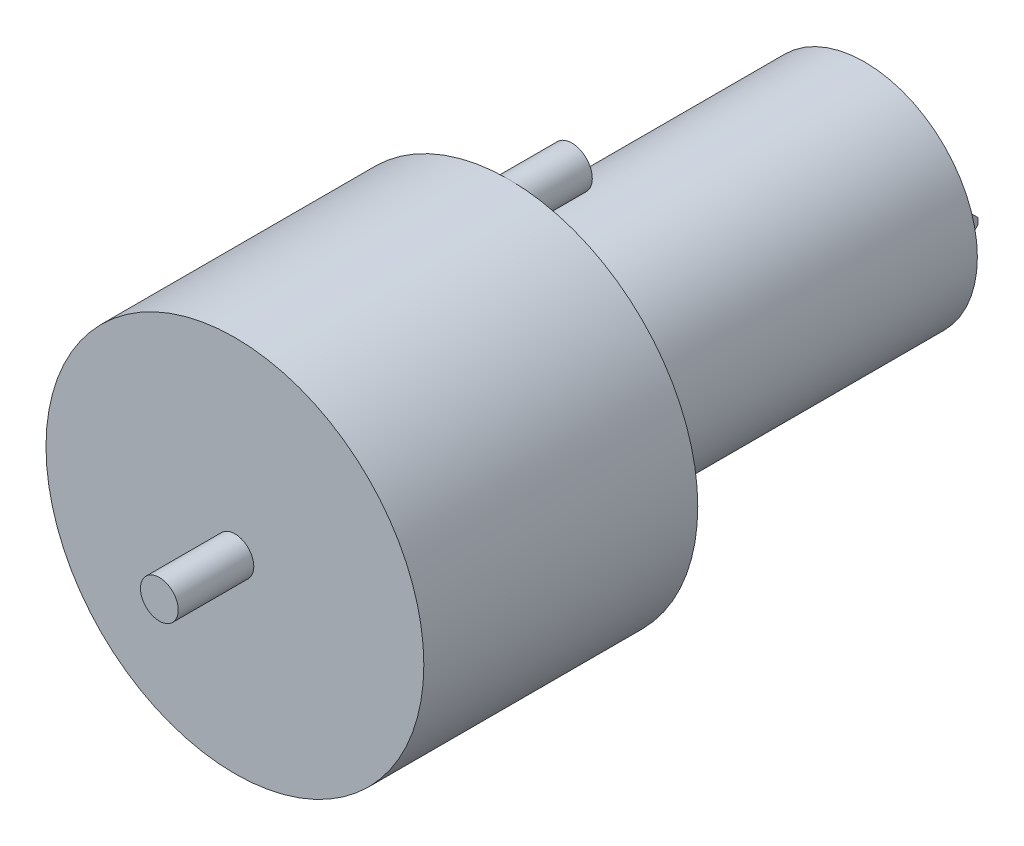
ISO-10303-21;
HEADER;
FILE_DESCRIPTION(('STEP AP214'),'2;1');
FILE_NAME('part.step','',(''),(''),'','','');
FILE_SCHEMA(('AUTOMOTIVE_DESIGN { 1 0 10303 214 1 1 1 1 }'));
ENDSEC;
DATA;
#1=APPLICATION_CONTEXT('core data for automotive mechanical design processes');
#2=APPLICATION_PROTOCOL_DEFINITION('international standard','automotive_design',2000,#1);
#3=PRODUCT_CONTEXT('',#1,'mechanical');
#4=PRODUCT('Part','Part','',(#3));
#5=PRODUCT_RELATED_PRODUCT_CATEGORY('part','',(#4));
#6=PRODUCT_DEFINITION_FORMATION('','',#4);
#7=PRODUCT_DEFINITION_CONTEXT('part definition',#1,'design');
#8=PRODUCT_DEFINITION('design','',#6,#7);
#9=PRODUCT_DEFINITION_SHAPE('','',#8);
#10=(LENGTH_UNIT() NAMED_UNIT(*) SI_UNIT(.MILLI.,.METRE.));
#11=(NAMED_UNIT(*) PLANE_ANGLE_UNIT() SI_UNIT($,.RADIAN.));
#12=(NAMED_UNIT(*) SI_UNIT($,.STERADIAN.) SOLID_ANGLE_UNIT());
#13=UNCERTAINTY_MEASURE_WITH_UNIT(LENGTH_MEASURE(1.E-05),#10,'distance_accuracy_value','');
#14=(GEOMETRIC_REPRESENTATION_CONTEXT(3) GLOBAL_UNCERTAINTY_ASSIGNED_CONTEXT((#13)) GLOBAL_UNIT_ASSIGNED_CONTEXT((#10,
#11,#12)) REPRESENTATION_CONTEXT('',''));
#15=CARTESIAN_POINT('',(0.,0.,0.));
#16=DIRECTION('',(0.,0.,1.));
#17=DIRECTION('',(1.,0.,0.));
#18=AXIS2_PLACEMENT_3D('',#15,#16,#17);
#19=CARTESIAN_POINT('',(0.,0.,-112.));
#20=DIRECTION('',(0.,0.,1.));
#21=DIRECTION('',(1.,0.,0.));
#22=AXIS2_PLACEMENT_3D('',#19,#20,#21);
#23=PLANE('',#22);
#24=DIRECTION('',(-1.,0.,0.));
#25=VECTOR('',#24,1.);
#26=CARTESIAN_POINT('',(13.,-1.5,-112.));
#27=LINE('',#26,#25);
#28=CARTESIAN_POINT('',(13.,-1.5,-112.));
#29=VERTEX_POINT('',#28);
#30=CARTESIAN_POINT('',(12.,-1.5,-112.));
#31=VERTEX_POINT('',#30);
#32=EDGE_CURVE('E68',#29,#31,#27,.T.);
#33=ORIENTED_EDGE('',*,*,#32,.F.);
#34=DIRECTION('',(0.,-1.,0.));
#35=VECTOR('',#34,1.);
#36=CARTESIAN_POINT('',(13.,-1.5,-112.));
#37=LINE('',#36,#35);
#38=CARTESIAN_POINT('',(13.,1.5,-112.));
#39=VERTEX_POINT('',#38);
#40=EDGE_CURVE('E181',#39,#29,#37,.T.);
#41=ORIENTED_EDGE('',*,*,#40,.F.);
#42=DIRECTION('',(-1.,0.,0.));
#43=VECTOR('',#42,1.);
#44=CARTESIAN_POINT('',(13.,1.5,-112.));
#45=LINE('',#44,#43);
#46=CARTESIAN_POINT('',(12.,1.5,-112.));
#47=VERTEX_POINT('',#46);
#48=EDGE_CURVE('E202',#39,#47,#45,.T.);
#49=ORIENTED_EDGE('',*,*,#48,.T.);
#50=DIRECTION('',(0.,-1.,0.));
#51=VECTOR('',#50,1.);
#52=CARTESIAN_POINT('',(12.,0.,-112.));
#53=LINE('',#52,#51);
#54=EDGE_CURVE('E186',#47,#31,#53,.T.);
#55=ORIENTED_EDGE('',*,*,#54,.T.);
#56=EDGE_LOOP('',(#33,#41,#49,#55));
#57=FACE_BOUND('',#56,.T.);
#58=CARTESIAN_POINT('',(0.,0.,-112.));
#59=DIRECTION('',(0.,0.,1.));
#60=DIRECTION('',(1.,0.,0.));
#61=AXIS2_PLACEMENT_3D('',#58,#59,#60);
#62=CIRCLE('',#61,17.9);
#63=CARTESIAN_POINT('',(17.9,0.,-112.));
#64=VERTEX_POINT('',#63);
#65=EDGE_CURVE('E11',#64,#64,#62,.T.);
#66=ORIENTED_EDGE('',*,*,#65,.F.);
#67=EDGE_LOOP('',(#66));
#68=FACE_BOUND('',#67,.T.);
#69=DIRECTION('',(0.,-1.,0.));
#70=VECTOR('',#69,1.);
#71=CARTESIAN_POINT('',(-13.,-1.5,-112.));
#72=LINE('',#71,#70);
#73=CARTESIAN_POINT('',(-13.,1.5,-112.));
#74=VERTEX_POINT('',#73);
#75=CARTESIAN_POINT('',(-13.,-1.5,-112.));
#76=VERTEX_POINT('',#75);
#77=EDGE_CURVE('E139',#74,#76,#72,.T.);
#78=ORIENTED_EDGE('',*,*,#77,.T.);
#79=DIRECTION('',(1.,0.,0.));
#80=VECTOR('',#79,1.);
#81=CARTESIAN_POINT('',(-13.,-1.5,-112.));
#82=LINE('',#81,#80);
#83=CARTESIAN_POINT('',(-12.,-1.5,-112.));
#84=VERTEX_POINT('',#83);
#85=EDGE_CURVE('E394',#76,#84,#82,.T.);
#86=ORIENTED_EDGE('',*,*,#85,.T.);
#87=DIRECTION('',(0.,-1.,0.));
#88=VECTOR('',#87,1.);
#89=CARTESIAN_POINT('',(-12.,0.,-112.));
#90=LINE('',#89,#88);
#91=CARTESIAN_POINT('',(-12.,1.5,-112.));
#92=VERTEX_POINT('',#91);
#93=EDGE_CURVE('E162',#92,#84,#90,.T.);
#94=ORIENTED_EDGE('',*,*,#93,.F.);
#95=DIRECTION('',(1.,0.,0.));
#96=VECTOR('',#95,1.);
#97=CARTESIAN_POINT('',(-13.,1.5,-112.));
#98=LINE('',#97,#96);
#99=EDGE_CURVE('E156',#74,#92,#98,.T.);
#100=ORIENTED_EDGE('',*,*,#99,.F.);
#101=EDGE_LOOP('',(#78,#86,#94,#100));
#102=FACE_BOUND('',#101,.T.);
#103=ADVANCED_FACE('F44',(#57,#68,#102),#23,.F.);
#104=CARTESIAN_POINT('',(0.,3.,0.));
#105=DIRECTION('',(0.,0.,-1.));
#106=DIRECTION('',(-1.,0.,0.));
#107=AXIS2_PLACEMENT_3D('',#104,#105,#106);
#108=PLANE('',#107);
#109=CARTESIAN_POINT('',(0.,0.,0.));
#110=DIRECTION('',(0.,0.,1.));
#111=DIRECTION('',(1.,0.,0.));
#112=AXIS2_PLACEMENT_3D('',#109,#110,#111);
#113=CIRCLE('',#112,3.);
#114=CARTESIAN_POINT('',(3.,0.,0.));
#115=VERTEX_POINT('',#114);
#116=EDGE_CURVE('E245',#115,#115,#113,.T.);
#117=ORIENTED_EDGE('',*,*,#116,.T.);
#118=EDGE_LOOP('',(#117));
#119=FACE_BOUND('',#118,.T.);
#120=ADVANCED_FACE('F46',(#119),#108,.F.);
#121=CARTESIAN_POINT('',(0.,0.,0.));
#122=DIRECTION('',(0.,0.,1.));
#123=DIRECTION('',(1.,0.,0.));
#124=AXIS2_PLACEMENT_3D('',#121,#122,#123);
#125=CYLINDRICAL_SURFACE('',#124,17.9);
#126=CARTESIAN_POINT('',(0.,0.,-55.5));
#127=DIRECTION('',(0.,0.,1.));
#128=DIRECTION('',(1.,0.,0.));
#129=AXIS2_PLACEMENT_3D('',#126,#127,#128);
#130=CIRCLE('',#129,17.9);
#131=CARTESIAN_POINT('',(17.9,0.,-55.5));
#132=VERTEX_POINT('',#131);
#133=EDGE_CURVE('E53',#132,#132,#130,.T.);
#134=ORIENTED_EDGE('',*,*,#133,.F.);
#135=EDGE_LOOP('',(#134));
#136=FACE_BOUND('',#135,.T.);
#137=ORIENTED_EDGE('',*,*,#65,.T.);
#138=EDGE_LOOP('',(#137));
#139=FACE_BOUND('',#138,.T.);
#140=ADVANCED_FACE('F271',(#136,#139),#125,.T.);
#141=CARTESIAN_POINT('',(0.,17.9,-55.5));
#142=DIRECTION('',(0.,0.,1.));
#143=DIRECTION('',(1.,0.,0.));
#144=AXIS2_PLACEMENT_3D('',#141,#142,#143);
#145=PLANE('',#144);
#146=CARTESIAN_POINT('',(0.,0.,-55.5));
#147=DIRECTION('',(0.,0.,1.));
#148=DIRECTION('',(1.,0.,0.));
#149=AXIS2_PLACEMENT_3D('',#146,#147,#148);
#150=CIRCLE('',#149,30.);
#151=CARTESIAN_POINT('',(0.,30.,-55.5));
#152=VERTEX_POINT('',#151);
#153=EDGE_CURVE('E260',#152,#152,#150,.T.);
#154=ORIENTED_EDGE('',*,*,#153,.F.);
#155=CARTESIAN_POINT('',(0.,26.75,-55.5));
#156=DIRECTION('',(0.,0.,-1.));
#157=DIRECTION('',(-1.,0.,0.));
#158=AXIS2_PLACEMENT_3D('',#155,#156,#157);
#159=CIRCLE('',#158,3.25);
#160=EDGE_CURVE('E240',#152,#152,#159,.T.);
#161=ORIENTED_EDGE('',*,*,#160,.F.);
#162=EDGE_LOOP('',(#154,#161));
#163=FACE_BOUND('',#162,.T.);
#164=ORIENTED_EDGE('',*,*,#133,.T.);
#165=EDGE_LOOP('',(#164));
#166=FACE_BOUND('',#165,.T.);
#167=ADVANCED_FACE('F269',(#163,#166),#145,.F.);
#168=CARTESIAN_POINT('',(0.,0.,0.));
#169=DIRECTION('',(0.,0.,1.));
#170=DIRECTION('',(1.,0.,0.));
#171=AXIS2_PLACEMENT_3D('',#168,#169,#170);
#172=CYLINDRICAL_SURFACE('',#171,30.);
#173=CARTESIAN_POINT('',(0.,0.,-12.));
#174=DIRECTION('',(0.,0.,1.));
#175=DIRECTION('',(1.,0.,0.));
#176=AXIS2_PLACEMENT_3D('',#173,#174,#175);
#177=CIRCLE('',#176,30.);
#178=CARTESIAN_POINT('',(30.,0.,-12.));
#179=VERTEX_POINT('',#178);
#180=EDGE_CURVE('E256',#179,#179,#177,.T.);
#181=ORIENTED_EDGE('',*,*,#180,.F.);
#182=EDGE_LOOP('',(#181));
#183=FACE_BOUND('',#182,.T.);
#184=ORIENTED_EDGE('',*,*,#153,.T.);
#185=EDGE_LOOP('',(#184));
#186=FACE_BOUND('',#185,.T.);
#187=ADVANCED_FACE('F285',(#183,#186),#172,.T.);
#188=CARTESIAN_POINT('',(0.,30.,-12.));
#189=DIRECTION('',(0.,0.,-1.));
#190=DIRECTION('',(-1.,0.,0.));
#191=AXIS2_PLACEMENT_3D('',#188,#189,#190);
#192=PLANE('',#191);
#193=CARTESIAN_POINT('',(0.,0.,-12.));
#194=DIRECTION('',(0.,0.,1.));
#195=DIRECTION('',(1.,0.,0.));
#196=AXIS2_PLACEMENT_3D('',#193,#194,#195);
#197=CIRCLE('',#196,3.);
#198=CARTESIAN_POINT('',(3.,0.,-12.));
#199=VERTEX_POINT('',#198);
#200=EDGE_CURVE('E252',#199,#199,#197,.T.);
#201=ORIENTED_EDGE('',*,*,#200,.F.);
#202=EDGE_LOOP('',(#201));
#203=FACE_BOUND('',#202,.T.);
#204=ORIENTED_EDGE('',*,*,#180,.T.);
#205=EDGE_LOOP('',(#204));
#206=FACE_BOUND('',#205,.T.);
#207=ADVANCED_FACE('F289',(#203,#206),#192,.F.);
#208=CARTESIAN_POINT('',(0.,0.,0.));
#209=DIRECTION('',(0.,0.,1.));
#210=DIRECTION('',(1.,0.,0.));
#211=AXIS2_PLACEMENT_3D('',#208,#209,#210);
#212=CYLINDRICAL_SURFACE('',#211,3.);
#213=ORIENTED_EDGE('',*,*,#116,.F.);
#214=EDGE_LOOP('',(#213));
#215=FACE_BOUND('',#214,.T.);
#216=ORIENTED_EDGE('',*,*,#200,.T.);
#217=EDGE_LOOP('',(#216));
#218=FACE_BOUND('',#217,.T.);
#219=ADVANCED_FACE('F293',(#215,#218),#212,.T.);
#220=CARTESIAN_POINT('',(0.,26.75,-65.5));
#221=DIRECTION('',(0.,0.,1.));
#222=DIRECTION('',(1.,0.,0.));
#223=AXIS2_PLACEMENT_3D('',#220,#221,#222);
#224=CYLINDRICAL_SURFACE('',#223,3.25);
#225=CARTESIAN_POINT('',(0.,26.75,-65.5));
#226=DIRECTION('',(0.,0.,-1.));
#227=DIRECTION('',(-1.,0.,0.));
#228=AXIS2_PLACEMENT_3D('',#225,#226,#227);
#229=CIRCLE('',#228,3.25);
#230=CARTESIAN_POINT('',(-3.25,26.75,-65.5));
#231=VERTEX_POINT('',#230);
#232=EDGE_CURVE('E241',#231,#231,#229,.T.);
#233=ORIENTED_EDGE('',*,*,#232,.F.);
#234=EDGE_LOOP('',(#233));
#235=FACE_BOUND('',#234,.T.);
#236=ORIENTED_EDGE('',*,*,#160,.T.);
#237=EDGE_LOOP('',(#236));
#238=FACE_BOUND('',#237,.T.);
#239=ADVANCED_FACE('F297',(#235,#238),#224,.T.);
#240=CARTESIAN_POINT('',(0.,26.75,-65.5));
#241=DIRECTION('',(0.,0.,-1.));
#242=DIRECTION('',(-1.,0.,0.));
#243=AXIS2_PLACEMENT_3D('',#240,#241,#242);
#244=PLANE('',#243);
#245=ORIENTED_EDGE('',*,*,#232,.T.);
#246=EDGE_LOOP('',(#245));
#247=FACE_BOUND('',#246,.T.);
#248=ADVANCED_FACE('F301',(#247),#244,.T.);
#249=CARTESIAN_POINT('',(13.,0.,0.));
#250=DIRECTION('',(-1.,0.,0.));
#251=DIRECTION('',(0.,0.,1.));
#252=AXIS2_PLACEMENT_3D('',#249,#250,#251);
#253=PLANE('',#252);
#254=ORIENTED_EDGE('',*,*,#40,.T.);
#255=DIRECTION('',(0.,0.,-1.));
#256=VECTOR('',#255,1.);
#257=CARTESIAN_POINT('',(13.,-1.5,-116.));
#258=LINE('',#257,#256);
#259=CARTESIAN_POINT('',(13.,-1.5,-116.));
#260=VERTEX_POINT('',#259);
#261=EDGE_CURVE('E185',#29,#260,#258,.T.);
#262=ORIENTED_EDGE('',*,*,#261,.T.);
#263=DIRECTION('',(0.,0.707106781186555,-0.70710678118654));
#264=VECTOR('',#263,1.);
#265=CARTESIAN_POINT('',(13.,-0.5,-117.));
#266=LINE('',#265,#264);
#267=CARTESIAN_POINT('',(13.,-0.5,-117.));
#268=VERTEX_POINT('',#267);
#269=EDGE_CURVE('E189',#260,#268,#266,.T.);
#270=ORIENTED_EDGE('',*,*,#269,.T.);
#271=DIRECTION('',(0.,1.,0.));
#272=VECTOR('',#271,1.);
#273=CARTESIAN_POINT('',(13.,0.5,-117.));
#274=LINE('',#273,#272);
#275=CARTESIAN_POINT('',(13.,0.5,-117.));
#276=VERTEX_POINT('',#275);
#277=EDGE_CURVE('E192',#268,#276,#274,.T.);
#278=ORIENTED_EDGE('',*,*,#277,.T.);
#279=DIRECTION('',(0.,0.70710678118655,0.707106781186545));
#280=VECTOR('',#279,1.);
#281=CARTESIAN_POINT('',(13.,1.49999999999999,-116.));
#282=LINE('',#281,#280);
#283=CARTESIAN_POINT('',(13.,1.49999999999999,-116.));
#284=VERTEX_POINT('',#283);
#285=EDGE_CURVE('E195',#276,#284,#282,.T.);
#286=ORIENTED_EDGE('',*,*,#285,.T.);
#287=DIRECTION('',(0.,0.,1.));
#288=VECTOR('',#287,1.);
#289=CARTESIAN_POINT('',(13.,1.5,-112.));
#290=LINE('',#289,#288);
#291=EDGE_CURVE('E198',#284,#39,#290,.T.);
#292=ORIENTED_EDGE('',*,*,#291,.T.);
#293=EDGE_LOOP('',(#254,#262,#270,#278,#286,#292));
#294=FACE_BOUND('',#293,.T.);
#295=CARTESIAN_POINT('',(13.,0.,-115.558241222878));
#296=DIRECTION('',(1.,0.,0.));
#297=DIRECTION('',(0.,0.,-1.));
#298=AXIS2_PLACEMENT_3D('',#295,#296,#297);
#299=CIRCLE('',#298,0.677279548997269);
#300=CARTESIAN_POINT('',(13.,0.,-116.235520771875));
#301=VERTEX_POINT('',#300);
#302=EDGE_CURVE('E171',#301,#301,#299,.T.);
#303=ORIENTED_EDGE('',*,*,#302,.F.);
#304=EDGE_LOOP('',(#303));
#305=FACE_BOUND('',#304,.T.);
#306=ADVANCED_FACE('F305',(#294,#305),#253,.F.);
#307=CARTESIAN_POINT('',(12.,0.,0.));
#308=DIRECTION('',(-1.,0.,0.));
#309=DIRECTION('',(0.,0.,1.));
#310=AXIS2_PLACEMENT_3D('',#307,#308,#309);
#311=PLANE('',#310);
#312=DIRECTION('',(0.,0.,-1.));
#313=VECTOR('',#312,1.);
#314=CARTESIAN_POINT('',(12.,-1.5,-116.));
#315=LINE('',#314,#313);
#316=CARTESIAN_POINT('',(12.,-1.5,-116.));
#317=VERTEX_POINT('',#316);
#318=EDGE_CURVE('E179',#31,#317,#315,.T.);
#319=ORIENTED_EDGE('',*,*,#318,.F.);
#320=ORIENTED_EDGE('',*,*,#54,.F.);
#321=DIRECTION('',(0.,0.,1.));
#322=VECTOR('',#321,1.);
#323=CARTESIAN_POINT('',(12.,1.5,-112.));
#324=LINE('',#323,#322);
#325=CARTESIAN_POINT('',(12.,1.49999999999999,-116.));
#326=VERTEX_POINT('',#325);
#327=EDGE_CURVE('E214',#326,#47,#324,.T.);
#328=ORIENTED_EDGE('',*,*,#327,.F.);
#329=DIRECTION('',(0.,0.70710678118655,0.707106781186545));
#330=VECTOR('',#329,1.);
#331=CARTESIAN_POINT('',(12.,1.49999999999999,-116.));
#332=LINE('',#331,#330);
#333=CARTESIAN_POINT('',(12.,0.5,-117.));
#334=VERTEX_POINT('',#333);
#335=EDGE_CURVE('E211',#334,#326,#332,.T.);
#336=ORIENTED_EDGE('',*,*,#335,.F.);
#337=DIRECTION('',(0.,1.,0.));
#338=VECTOR('',#337,1.);
#339=CARTESIAN_POINT('',(12.,0.5,-117.));
#340=LINE('',#339,#338);
#341=CARTESIAN_POINT('',(12.,-0.5,-117.));
#342=VERTEX_POINT('',#341);
#343=EDGE_CURVE('E208',#342,#334,#340,.T.);
#344=ORIENTED_EDGE('',*,*,#343,.F.);
#345=DIRECTION('',(0.,0.707106781186555,-0.70710678118654));
#346=VECTOR('',#345,1.);
#347=CARTESIAN_POINT('',(12.,-0.5,-117.));
#348=LINE('',#347,#346);
#349=EDGE_CURVE('E205',#317,#342,#348,.T.);
#350=ORIENTED_EDGE('',*,*,#349,.F.);
#351=EDGE_LOOP('',(#319,#320,#328,#336,#344,#350));
#352=FACE_BOUND('',#351,.T.);
#353=CARTESIAN_POINT('',(12.,0.,-115.558241222878));
#354=DIRECTION('',(1.,0.,0.));
#355=DIRECTION('',(0.,0.,-1.));
#356=AXIS2_PLACEMENT_3D('',#353,#354,#355);
#357=CIRCLE('',#356,0.677279548997269);
#358=CARTESIAN_POINT('',(12.,0.,-116.235520771875));
#359=VERTEX_POINT('',#358);
#360=EDGE_CURVE('E164',#359,#359,#357,.T.);
#361=ORIENTED_EDGE('',*,*,#360,.T.);
#362=EDGE_LOOP('',(#361));
#363=FACE_BOUND('',#362,.T.);
#364=ADVANCED_FACE('F311',(#352,#363),#311,.T.);
#365=CARTESIAN_POINT('',(13.,-1.5,-116.));
#366=DIRECTION('',(0.,1.,0.));
#367=DIRECTION('',(0.,0.,1.));
#368=AXIS2_PLACEMENT_3D('',#365,#366,#367);
#369=PLANE('',#368);
#370=ORIENTED_EDGE('',*,*,#318,.T.);
#371=DIRECTION('',(-1.,0.,0.));
#372=VECTOR('',#371,1.);
#373=CARTESIAN_POINT('',(13.,-1.5,-116.));
#374=LINE('',#373,#372);
#375=EDGE_CURVE('E234',#260,#317,#374,.T.);
#376=ORIENTED_EDGE('',*,*,#375,.F.);
#377=ORIENTED_EDGE('',*,*,#261,.F.);
#378=ORIENTED_EDGE('',*,*,#32,.T.);
#379=EDGE_LOOP('',(#370,#376,#377,#378));
#380=FACE_BOUND('',#379,.T.);
#381=ADVANCED_FACE('F307',(#380),#369,.F.);
#382=CARTESIAN_POINT('',(13.,-0.5,-117.));
#383=DIRECTION('',(0.,0.70710678118654,0.707106781186555));
#384=DIRECTION('',(0.,-0.707106781186555,0.70710678118654));
#385=AXIS2_PLACEMENT_3D('',#382,#383,#384);
#386=PLANE('',#385);
#387=ORIENTED_EDGE('',*,*,#349,.T.);
#388=DIRECTION('',(-1.,0.,0.));
#389=VECTOR('',#388,1.);
#390=CARTESIAN_POINT('',(13.,-0.5,-117.));
#391=LINE('',#390,#389);
#392=EDGE_CURVE('E230',#268,#342,#391,.T.);
#393=ORIENTED_EDGE('',*,*,#392,.F.);
#394=ORIENTED_EDGE('',*,*,#269,.F.);
#395=ORIENTED_EDGE('',*,*,#375,.T.);
#396=EDGE_LOOP('',(#387,#393,#394,#395));
#397=FACE_BOUND('',#396,.T.);
#398=ADVANCED_FACE('F310',(#397),#386,.F.);
#399=CARTESIAN_POINT('',(13.,0.5,-117.));
#400=DIRECTION('',(0.,0.,1.));
#401=DIRECTION('',(1.,0.,0.));
#402=AXIS2_PLACEMENT_3D('',#399,#400,#401);
#403=PLANE('',#402);
#404=ORIENTED_EDGE('',*,*,#343,.T.);
#405=DIRECTION('',(-1.,0.,0.));
#406=VECTOR('',#405,1.);
#407=CARTESIAN_POINT('',(13.,0.5,-117.));
#408=LINE('',#407,#406);
#409=EDGE_CURVE('E226',#276,#334,#408,.T.);
#410=ORIENTED_EDGE('',*,*,#409,.F.);
#411=ORIENTED_EDGE('',*,*,#277,.F.);
#412=ORIENTED_EDGE('',*,*,#392,.T.);
#413=EDGE_LOOP('',(#404,#410,#411,#412));
#414=FACE_BOUND('',#413,.T.);
#415=ADVANCED_FACE('F315',(#414),#403,.F.);
#416=CARTESIAN_POINT('',(13.,1.49999999999999,-116.));
#417=DIRECTION('',(0.,-0.707106781186545,0.70710678118655));
#418=DIRECTION('',(0.,-0.70710678118655,-0.707106781186545));
#419=AXIS2_PLACEMENT_3D('',#416,#417,#418);
#420=PLANE('',#419);
#421=ORIENTED_EDGE('',*,*,#335,.T.);
#422=DIRECTION('',(-1.,0.,0.));
#423=VECTOR('',#422,1.);
#424=CARTESIAN_POINT('',(13.,1.49999999999999,-116.));
#425=LINE('',#424,#423);
#426=EDGE_CURVE('E222',#284,#326,#425,.T.);
#427=ORIENTED_EDGE('',*,*,#426,.F.);
#428=ORIENTED_EDGE('',*,*,#285,.F.);
#429=ORIENTED_EDGE('',*,*,#409,.T.);
#430=EDGE_LOOP('',(#421,#427,#428,#429));
#431=FACE_BOUND('',#430,.T.);
#432=ADVANCED_FACE('F319',(#431),#420,.F.);
#433=CARTESIAN_POINT('',(13.,1.5,-112.));
#434=DIRECTION('',(0.,-1.,0.));
#435=DIRECTION('',(0.,0.,-1.));
#436=AXIS2_PLACEMENT_3D('',#433,#434,#435);
#437=PLANE('',#436);
#438=ORIENTED_EDGE('',*,*,#327,.T.);
#439=ORIENTED_EDGE('',*,*,#48,.F.);
#440=ORIENTED_EDGE('',*,*,#291,.F.);
#441=ORIENTED_EDGE('',*,*,#426,.T.);
#442=EDGE_LOOP('',(#438,#439,#440,#441));
#443=FACE_BOUND('',#442,.T.);
#444=ADVANCED_FACE('F323',(#443),#437,.F.);
#445=CARTESIAN_POINT('',(13.,0.,-115.558241222878));
#446=DIRECTION('',(-1.,0.,0.));
#447=DIRECTION('',(0.,0.,1.));
#448=AXIS2_PLACEMENT_3D('',#445,#446,#447);
#449=CYLINDRICAL_SURFACE('',#448,0.677279548997269);
#450=ORIENTED_EDGE('',*,*,#302,.T.);
#451=EDGE_LOOP('',(#450));
#452=FACE_BOUND('',#451,.T.);
#453=ORIENTED_EDGE('',*,*,#360,.F.);
#454=EDGE_LOOP('',(#453));
#455=FACE_BOUND('',#454,.T.);
#456=ADVANCED_FACE('F327',(#452,#455),#449,.F.);
#457=CARTESIAN_POINT('',(-13.,1.5,-112.));
#458=DIRECTION('',(0.,1.,0.));
#459=DIRECTION('',(0.,0.,1.));
#460=AXIS2_PLACEMENT_3D('',#457,#458,#459);
#461=PLANE('',#460);
#462=DIRECTION('',(0.,0.,1.));
#463=VECTOR('',#462,1.);
#464=CARTESIAN_POINT('',(-12.,1.5,-112.));
#465=LINE('',#464,#463);
#466=CARTESIAN_POINT('',(-12.,1.49999999999999,-116.));
#467=VERTEX_POINT('',#466);
#468=EDGE_CURVE('E60',#467,#92,#465,.T.);
#469=ORIENTED_EDGE('',*,*,#468,.F.);
#470=DIRECTION('',(1.,0.,0.));
#471=VECTOR('',#470,1.);
#472=CARTESIAN_POINT('',(-13.,1.49999999999999,-116.));
#473=LINE('',#472,#471);
#474=CARTESIAN_POINT('',(-13.,1.49999999999999,-116.));
#475=VERTEX_POINT('',#474);
#476=EDGE_CURVE('E158',#475,#467,#473,.T.);
#477=ORIENTED_EDGE('',*,*,#476,.F.);
#478=DIRECTION('',(0.,0.,1.));
#479=VECTOR('',#478,1.);
#480=CARTESIAN_POINT('',(-13.,1.5,-112.));
#481=LINE('',#480,#479);
#482=EDGE_CURVE('E143',#475,#74,#481,.T.);
#483=ORIENTED_EDGE('',*,*,#482,.T.);
#484=ORIENTED_EDGE('',*,*,#99,.T.);
#485=EDGE_LOOP('',(#469,#477,#483,#484));
#486=FACE_BOUND('',#485,.T.);
#487=ADVANCED_FACE('F155',(#486),#461,.T.);
#488=CARTESIAN_POINT('',(-13.,1.49999999999999,-116.));
#489=DIRECTION('',(0.,0.707106781186545,-0.70710678118655));
#490=DIRECTION('',(0.,0.70710678118655,0.707106781186545));
#491=AXIS2_PLACEMENT_3D('',#488,#489,#490);
#492=PLANE('',#491);
#493=DIRECTION('',(0.,0.70710678118655,0.707106781186545));
#494=VECTOR('',#493,1.);
#495=CARTESIAN_POINT('',(-12.,1.49999999999999,-116.));
#496=LINE('',#495,#494);
#497=CARTESIAN_POINT('',(-12.,0.5,-117.));
#498=VERTEX_POINT('',#497);
#499=EDGE_CURVE('E399',#498,#467,#496,.T.);
#500=ORIENTED_EDGE('',*,*,#499,.F.);
#501=DIRECTION('',(1.,0.,0.));
#502=VECTOR('',#501,1.);
#503=CARTESIAN_POINT('',(-13.,0.5,-117.));
#504=LINE('',#503,#502);
#505=CARTESIAN_POINT('',(-13.,0.5,-117.));
#506=VERTEX_POINT('',#505);
#507=EDGE_CURVE('E173',#506,#498,#504,.T.);
#508=ORIENTED_EDGE('',*,*,#507,.F.);
#509=DIRECTION('',(0.,0.70710678118655,0.707106781186545));
#510=VECTOR('',#509,1.);
#511=CARTESIAN_POINT('',(-13.,1.49999999999999,-116.));
#512=LINE('',#511,#510);
#513=EDGE_CURVE('E160',#506,#475,#512,.T.);
#514=ORIENTED_EDGE('',*,*,#513,.T.);
#515=ORIENTED_EDGE('',*,*,#476,.T.);
#516=EDGE_LOOP('',(#500,#508,#514,#515));
#517=FACE_BOUND('',#516,.T.);
#518=ADVANCED_FACE('F340',(#517),#492,.T.);
#519=CARTESIAN_POINT('',(-13.,0.5,-117.));
#520=DIRECTION('',(0.,0.,-1.));
#521=DIRECTION('',(-1.,0.,0.));
#522=AXIS2_PLACEMENT_3D('',#519,#520,#521);
#523=PLANE('',#522);
#524=DIRECTION('',(0.,1.,0.));
#525=VECTOR('',#524,1.);
#526=CARTESIAN_POINT('',(-12.,0.5,-117.));
#527=LINE('',#526,#525);
#528=CARTESIAN_POINT('',(-12.,-0.5,-117.));
#529=VERTEX_POINT('',#528);
#530=EDGE_CURVE('E402',#529,#498,#527,.T.);
#531=ORIENTED_EDGE('',*,*,#530,.F.);
#532=DIRECTION('',(1.,0.,0.));
#533=VECTOR('',#532,1.);
#534=CARTESIAN_POINT('',(-13.,-0.5,-117.));
#535=LINE('',#534,#533);
#536=CARTESIAN_POINT('',(-13.,-0.5,-117.));
#537=VERTEX_POINT('',#536);
#538=EDGE_CURVE('E418',#537,#529,#535,.T.);
#539=ORIENTED_EDGE('',*,*,#538,.F.);
#540=DIRECTION('',(0.,1.,0.));
#541=VECTOR('',#540,1.);
#542=CARTESIAN_POINT('',(-13.,0.5,-117.));
#543=LINE('',#542,#541);
#544=EDGE_CURVE('E384',#537,#506,#543,.T.);
#545=ORIENTED_EDGE('',*,*,#544,.T.);
#546=ORIENTED_EDGE('',*,*,#507,.T.);
#547=EDGE_LOOP('',(#531,#539,#545,#546));
#548=FACE_BOUND('',#547,.T.);
#549=ADVANCED_FACE('F343',(#548),#523,.T.);
#550=CARTESIAN_POINT('',(-13.,-0.5,-117.));
#551=DIRECTION('',(0.,-0.70710678118654,-0.707106781186555));
#552=DIRECTION('',(0.,0.707106781186555,-0.70710678118654));
#553=AXIS2_PLACEMENT_3D('',#550,#551,#552);
#554=PLANE('',#553);
#555=DIRECTION('',(0.,0.707106781186555,-0.70710678118654));
#556=VECTOR('',#555,1.);
#557=CARTESIAN_POINT('',(-12.,-0.5,-117.));
#558=LINE('',#557,#556);
#559=CARTESIAN_POINT('',(-12.,-1.5,-116.));
#560=VERTEX_POINT('',#559);
#561=EDGE_CURVE('E406',#560,#529,#558,.T.);
#562=ORIENTED_EDGE('',*,*,#561,.F.);
#563=DIRECTION('',(1.,0.,0.));
#564=VECTOR('',#563,1.);
#565=CARTESIAN_POINT('',(-13.,-1.5,-116.));
#566=LINE('',#565,#564);
#567=CARTESIAN_POINT('',(-13.,-1.5,-116.));
#568=VERTEX_POINT('',#567);
#569=EDGE_CURVE('E415',#568,#560,#566,.T.);
#570=ORIENTED_EDGE('',*,*,#569,.F.);
#571=DIRECTION('',(0.,0.707106781186555,-0.70710678118654));
#572=VECTOR('',#571,1.);
#573=CARTESIAN_POINT('',(-13.,-0.5,-117.));
#574=LINE('',#573,#572);
#575=EDGE_CURVE('E388',#568,#537,#574,.T.);
#576=ORIENTED_EDGE('',*,*,#575,.T.);
#577=ORIENTED_EDGE('',*,*,#538,.T.);
#578=EDGE_LOOP('',(#562,#570,#576,#577));
#579=FACE_BOUND('',#578,.T.);
#580=ADVANCED_FACE('F347',(#579),#554,.T.);
#581=CARTESIAN_POINT('',(-13.,-1.5,-116.));
#582=DIRECTION('',(0.,-1.,0.));
#583=DIRECTION('',(0.,0.,-1.));
#584=AXIS2_PLACEMENT_3D('',#581,#582,#583);
#585=PLANE('',#584);
#586=DIRECTION('',(0.,0.,-1.));
#587=VECTOR('',#586,1.);
#588=CARTESIAN_POINT('',(-12.,-1.5,-116.));
#589=LINE('',#588,#587);
#590=EDGE_CURVE('E152',#84,#560,#589,.T.);
#591=ORIENTED_EDGE('',*,*,#590,.F.);
#592=ORIENTED_EDGE('',*,*,#85,.F.);
#593=DIRECTION('',(0.,0.,-1.));
#594=VECTOR('',#593,1.);
#595=CARTESIAN_POINT('',(-13.,-1.5,-116.));
#596=LINE('',#595,#594);
#597=EDGE_CURVE('E147',#76,#568,#596,.T.);
#598=ORIENTED_EDGE('',*,*,#597,.T.);
#599=ORIENTED_EDGE('',*,*,#569,.T.);
#600=EDGE_LOOP('',(#591,#592,#598,#599));
#601=FACE_BOUND('',#600,.T.);
#602=ADVANCED_FACE('F351',(#601),#585,.T.);
#603=CARTESIAN_POINT('',(-13.,0.,0.));
#604=DIRECTION('',(1.,0.,0.));
#605=DIRECTION('',(0.,0.,1.));
#606=AXIS2_PLACEMENT_3D('',#603,#604,#605);
#607=PLANE('',#606);
#608=CARTESIAN_POINT('',(-13.,0.,-115.558241222878));
#609=DIRECTION('',(1.,0.,0.));
#610=DIRECTION('',(0.,0.,-1.));
#611=AXIS2_PLACEMENT_3D('',#608,#609,#610);
#612=CIRCLE('',#611,0.677279548997269);
#613=CARTESIAN_POINT('',(-13.,0.,-116.235520771875));
#614=VERTEX_POINT('',#613);
#615=EDGE_CURVE('E371',#614,#614,#612,.T.);
#616=ORIENTED_EDGE('',*,*,#615,.T.);
#617=EDGE_LOOP('',(#616));
#618=FACE_BOUND('',#617,.T.);
#619=ORIENTED_EDGE('',*,*,#77,.F.);
#620=ORIENTED_EDGE('',*,*,#482,.F.);
#621=ORIENTED_EDGE('',*,*,#513,.F.);
#622=ORIENTED_EDGE('',*,*,#544,.F.);
#623=ORIENTED_EDGE('',*,*,#575,.F.);
#624=ORIENTED_EDGE('',*,*,#597,.F.);
#625=EDGE_LOOP('',(#619,#620,#621,#622,#623,#624));
#626=FACE_BOUND('',#625,.T.);
#627=ADVANCED_FACE('F141',(#618,#626),#607,.F.);
#628=CARTESIAN_POINT('',(-12.,0.,0.));
#629=DIRECTION('',(1.,0.,0.));
#630=DIRECTION('',(0.,0.,1.));
#631=AXIS2_PLACEMENT_3D('',#628,#629,#630);
#632=PLANE('',#631);
#633=CARTESIAN_POINT('',(-12.,0.,-115.558241222878));
#634=DIRECTION('',(1.,0.,0.));
#635=DIRECTION('',(0.,0.,-1.));
#636=AXIS2_PLACEMENT_3D('',#633,#634,#635);
#637=CIRCLE('',#636,0.677279548997269);
#638=CARTESIAN_POINT('',(-12.,0.,-116.235520771875));
#639=VERTEX_POINT('',#638);
#640=EDGE_CURVE('E374',#639,#639,#637,.T.);
#641=ORIENTED_EDGE('',*,*,#640,.F.);
#642=EDGE_LOOP('',(#641));
#643=FACE_BOUND('',#642,.T.);
#644=ORIENTED_EDGE('',*,*,#93,.T.);
#645=ORIENTED_EDGE('',*,*,#590,.T.);
#646=ORIENTED_EDGE('',*,*,#561,.T.);
#647=ORIENTED_EDGE('',*,*,#530,.T.);
#648=ORIENTED_EDGE('',*,*,#499,.T.);
#649=ORIENTED_EDGE('',*,*,#468,.T.);
#650=EDGE_LOOP('',(#644,#645,#646,#647,#648,#649));
#651=FACE_BOUND('',#650,.T.);
#652=ADVANCED_FACE('F356',(#643,#651),#632,.T.);
#653=CARTESIAN_POINT('',(-13.,0.,-115.558241222878));
#654=DIRECTION('',(1.,0.,0.));
#655=DIRECTION('',(0.,0.,-1.));
#656=AXIS2_PLACEMENT_3D('',#653,#654,#655);
#657=CYLINDRICAL_SURFACE('',#656,0.677279548997269);
#658=ORIENTED_EDGE('',*,*,#615,.F.);
#659=EDGE_LOOP('',(#658));
#660=FACE_BOUND('',#659,.T.);
#661=ORIENTED_EDGE('',*,*,#640,.T.);
#662=EDGE_LOOP('',(#661));
#663=FACE_BOUND('',#662,.T.);
#664=ADVANCED_FACE('F359',(#660,#663),#657,.F.);
#665=CLOSED_SHELL('',(#103,#120,#140,#167,#187,#207,#219,#239,#248,#306,#364,#381,#398,#415,
#432,#444,#456,#487,#518,#549,#580,#602,#627,#652,#664));
#666=MANIFOLD_SOLID_BREP('B2',#665);
#667=ADVANCED_BREP_SHAPE_REPRESENTATION('',(#18,#666),#14);
#668=SHAPE_DEFINITION_REPRESENTATION(#9,#667);
ENDSEC;
END-ISO-10303-21;
